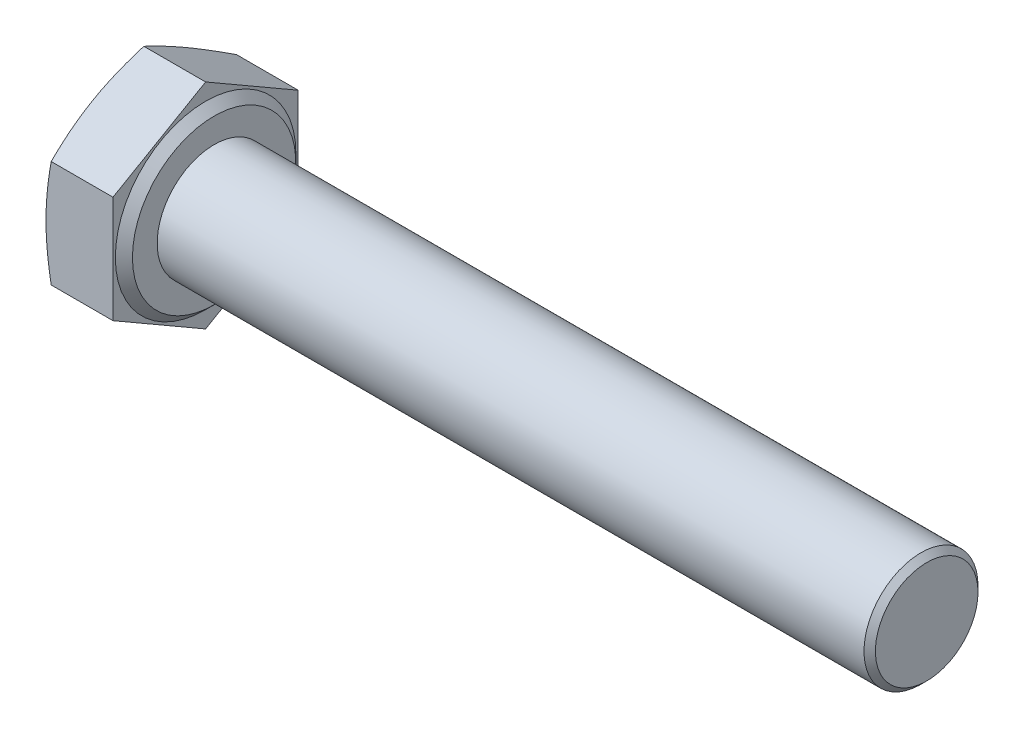
ISO-10303-21;
HEADER;
FILE_DESCRIPTION(('STEP AP214'),'2;1');
FILE_NAME('part.step','',(''),(''),'','','');
FILE_SCHEMA(('AUTOMOTIVE_DESIGN { 1 0 10303 214 1 1 1 1 }'));
ENDSEC;
DATA;
#1=APPLICATION_CONTEXT('core data for automotive mechanical design processes');
#2=APPLICATION_PROTOCOL_DEFINITION('international standard','automotive_design',2000,#1);
#3=PRODUCT_CONTEXT('',#1,'mechanical');
#4=PRODUCT('Part','Part','',(#3));
#5=PRODUCT_RELATED_PRODUCT_CATEGORY('part','',(#4));
#6=PRODUCT_DEFINITION_FORMATION('','',#4);
#7=PRODUCT_DEFINITION_CONTEXT('part definition',#1,'design');
#8=PRODUCT_DEFINITION('design','',#6,#7);
#9=PRODUCT_DEFINITION_SHAPE('','',#8);
#10=(LENGTH_UNIT() NAMED_UNIT(*) SI_UNIT(.MILLI.,.METRE.));
#11=(NAMED_UNIT(*) PLANE_ANGLE_UNIT() SI_UNIT($,.RADIAN.));
#12=(NAMED_UNIT(*) SI_UNIT($,.STERADIAN.) SOLID_ANGLE_UNIT());
#13=UNCERTAINTY_MEASURE_WITH_UNIT(LENGTH_MEASURE(1.E-05),#10,'distance_accuracy_value','');
#14=(GEOMETRIC_REPRESENTATION_CONTEXT(3) GLOBAL_UNCERTAINTY_ASSIGNED_CONTEXT((#13)) GLOBAL_UNIT_ASSIGNED_CONTEXT((#10,
#11,#12)) REPRESENTATION_CONTEXT('',''));
#15=CARTESIAN_POINT('',(0.,0.,0.));
#16=DIRECTION('',(0.,0.,1.));
#17=DIRECTION('',(1.,0.,0.));
#18=AXIS2_PLACEMENT_3D('',#15,#16,#17);
#19=CARTESIAN_POINT('',(5.3,-11.2583302491977,-6.5));
#20=DIRECTION('',(1.,0.,0.));
#21=DIRECTION('',(0.,0.,-1.));
#22=AXIS2_PLACEMENT_3D('',#19,#20,#21);
#23=PLANE('',#22);
#24=CARTESIAN_POINT('',(5.3,0.,0.));
#25=DIRECTION('',(-1.,0.,0.));
#26=DIRECTION('',(0.,0.,1.));
#27=AXIS2_PLACEMENT_3D('',#24,#25,#26);
#28=CIRCLE('',#27,5.735);
#29=CARTESIAN_POINT('',(5.3,0.,5.735));
#30=VERTEX_POINT('',#29);
#31=EDGE_CURVE('E253',#30,#30,#28,.T.);
#32=ORIENTED_EDGE('',*,*,#31,.F.);
#33=EDGE_LOOP('',(#32));
#34=FACE_BOUND('',#33,.T.);
#35=CARTESIAN_POINT('',(5.3,0.,0.));
#36=DIRECTION('',(1.,0.,0.));
#37=DIRECTION('',(0.,0.,-1.));
#38=AXIS2_PLACEMENT_3D('',#35,#36,#37);
#39=CIRCLE('',#38,4.);
#40=CARTESIAN_POINT('',(5.3,0.,-4.));
#41=VERTEX_POINT('',#40);
#42=EDGE_CURVE('E381',#41,#41,#39,.T.);
#43=ORIENTED_EDGE('',*,*,#42,.F.);
#44=EDGE_LOOP('',(#43));
#45=FACE_BOUND('',#44,.T.);
#46=ADVANCED_FACE('F36',(#34,#45),#23,.T.);
#47=CARTESIAN_POINT('',(5.3,-3.75277674973257,6.5));
#48=DIRECTION('',(0.,0.866025403784439,-0.5));
#49=DIRECTION('',(0.,0.5,0.866025403784439));
#50=AXIS2_PLACEMENT_3D('',#47,#48,#49);
#51=PLANE('',#50);
#52=CARTESIAN_POINT('',(0.366033571399917,-7.50566896951897,-0.000199999999999111));
#53=CARTESIAN_POINT('',(0.309444020524644,-7.35024872046989,0.268995767878022));
#54=CARTESIAN_POINT('',(0.257966025840877,-7.19431596160415,0.53907922879786));
#55=CARTESIAN_POINT('',(0.167398453510307,-6.88143655010517,1.08100226615635));
#56=CARTESIAN_POINT('',(0.128318569974497,-6.72448920151499,1.35284304802776));
#57=CARTESIAN_POINT('',(0.0651079760464742,-6.41132237124561,1.89526390929962));
#58=CARTESIAN_POINT('',(0.0408393932631412,-6.25511004161362,2.16583160099093));
#59=CARTESIAN_POINT('',(0.00828840244356363,-5.94232007682223,2.70759971210731));
#60=CARTESIAN_POINT('',(0.,-5.78574260071054,2.97879985605365));
#61=CARTESIAN_POINT('',(0.,-5.47258764848716,3.52120014394635));
#62=CARTESIAN_POINT('',(0.00828840244356352,-5.31601017237547,3.79240028789269));
#63=CARTESIAN_POINT('',(0.0408393932631413,-5.00322020758407,4.33416839900907));
#64=CARTESIAN_POINT('',(0.0651079760464745,-4.84700787795208,4.60473609070038));
#65=CARTESIAN_POINT('',(0.128318569974498,-4.53384104768271,5.14715695197224));
#66=CARTESIAN_POINT('',(0.167398453510307,-4.37689369909253,5.41899773384365));
#67=CARTESIAN_POINT('',(0.257966025840878,-4.06401428759354,5.96092077120214));
#68=CARTESIAN_POINT('',(0.309444020524644,-3.90808152872781,6.23100423212198));
#69=CARTESIAN_POINT('',(0.366033571399917,-3.75266127967873,6.5002));
#70=B_SPLINE_CURVE_WITH_KNOTS('',3,(#52,#53,#54,#55,#56,#57,#58,#59,#60,#61,#62,#63,#64,#65,#66,
#67,#68,#69),.UNSPECIFIED.,.F.,.F.,(4,2,2,2,2,2,2,2,4),(0.,0.947946776379686,1.89663293805397,
2.83634783106806,3.77571015417899,4.71507247728992,5.65478737030401,6.6034735319783,
7.55142030835798),.UNSPECIFIED.);
#71=CARTESIAN_POINT('',(0.365991542767518,-7.50555349946513,0.));
#72=VERTEX_POINT('',#71);
#73=CARTESIAN_POINT('',(0.,-5.62916512459885,3.25));
#74=VERTEX_POINT('',#73);
#75=EDGE_CURVE('E170',#72,#74,#70,.T.);
#76=ORIENTED_EDGE('',*,*,#75,.F.);
#77=DIRECTION('',(-1.,0.,0.));
#78=VECTOR('',#77,1.);
#79=CARTESIAN_POINT('',(5.3,-7.50555349946513,0.));
#80=LINE('',#79,#78);
#81=CARTESIAN_POINT('',(4.7,-7.50555349946513,0.));
#82=VERTEX_POINT('',#81);
#83=EDGE_CURVE('E145',#82,#72,#80,.T.);
#84=ORIENTED_EDGE('',*,*,#83,.F.);
#85=DIRECTION('',(0.,-0.5,-0.866025403784439));
#86=VECTOR('',#85,1.);
#87=CARTESIAN_POINT('',(4.7,-3.75277674973257,6.5));
#88=LINE('',#87,#86);
#89=CARTESIAN_POINT('',(4.7,-3.75277674973257,6.5));
#90=VERTEX_POINT('',#89);
#91=EDGE_CURVE('E136',#90,#82,#88,.T.);
#92=ORIENTED_EDGE('',*,*,#91,.F.);
#93=DIRECTION('',(-1.,0.,0.));
#94=VECTOR('',#93,1.);
#95=CARTESIAN_POINT('',(5.3,-3.75277674973257,6.5));
#96=LINE('',#95,#94);
#97=CARTESIAN_POINT('',(0.365991542767518,-3.75277674973257,6.5));
#98=VERTEX_POINT('',#97);
#99=EDGE_CURVE('E131',#90,#98,#96,.T.);
#100=ORIENTED_EDGE('',*,*,#99,.T.);
#101=EDGE_CURVE('E124',#74,#98,#70,.T.);
#102=ORIENTED_EDGE('',*,*,#101,.F.);
#103=EDGE_LOOP('',(#76,#84,#92,#100,#102));
#104=FACE_BOUND('',#103,.T.);
#105=ADVANCED_FACE('F233',(#104),#51,.F.);
#106=CARTESIAN_POINT('',(5.3,-7.50555349946513,0.));
#107=DIRECTION('',(0.,0.866025403784439,0.5));
#108=DIRECTION('',(0.,-0.5,0.866025403784439));
#109=AXIS2_PLACEMENT_3D('',#106,#107,#108);
#110=PLANE('',#109);
#111=CARTESIAN_POINT('',(0.366033571399918,-3.75266127967873,-6.5002));
#112=CARTESIAN_POINT('',(0.309444020524644,-3.90808152872781,-6.23100423212198));
#113=CARTESIAN_POINT('',(0.257966025840878,-4.06401428759355,-5.96092077120214));
#114=CARTESIAN_POINT('',(0.167398453510308,-4.37689369909253,-5.41899773384365));
#115=CARTESIAN_POINT('',(0.128318569974498,-4.53384104768271,-5.14715695197224));
#116=CARTESIAN_POINT('',(0.0651079760464751,-4.84700787795209,-4.60473609070038));
#117=CARTESIAN_POINT('',(0.0408393932631418,-5.00322020758408,-4.33416839900907));
#118=CARTESIAN_POINT('',(0.00828840244356392,-5.31601017237547,-3.79240028789269));
#119=CARTESIAN_POINT('',(0.,-5.47258764848716,-3.52120014394635));
#120=CARTESIAN_POINT('',(0.,-5.78574260071054,-2.97879985605365));
#121=CARTESIAN_POINT('',(0.00828840244356391,-5.94232007682223,-2.7075997121073));
#122=CARTESIAN_POINT('',(0.0408393932631417,-6.25511004161362,-2.16583160099092));
#123=CARTESIAN_POINT('',(0.0651079760464749,-6.41132237124561,-1.89526390929962));
#124=CARTESIAN_POINT('',(0.128318569974498,-6.72448920151499,-1.35284304802776));
#125=CARTESIAN_POINT('',(0.167398453510307,-6.88143655010517,-1.08100226615635));
#126=CARTESIAN_POINT('',(0.257966025840877,-7.19431596160415,-0.539079228797858));
#127=CARTESIAN_POINT('',(0.309444020524644,-7.35024872046989,-0.26899576787802));
#128=CARTESIAN_POINT('',(0.366033571399917,-7.50566896951897,0.000200000000000513));
#129=B_SPLINE_CURVE_WITH_KNOTS('',3,(#111,#112,#113,#114,#115,#116,#117,#118,#119,#120,#121,
#122,#123,#124,#125,#126,#127,#128),.UNSPECIFIED.,.F.,.F.,(4,2,2,2,2,2,2,2,4),(0.,
0.947946776379686,1.89663293805397,2.83634783106806,3.77571015417899,4.71507247728992,
5.65478737030401,6.6034735319783,7.55142030835798),.UNSPECIFIED.);
#130=CARTESIAN_POINT('',(0.365991542767518,-3.75277674973257,-6.5));
#131=VERTEX_POINT('',#130);
#132=CARTESIAN_POINT('',(0.,-5.62916512459885,-3.25));
#133=VERTEX_POINT('',#132);
#134=EDGE_CURVE('E176',#131,#133,#129,.T.);
#135=ORIENTED_EDGE('',*,*,#134,.F.);
#136=DIRECTION('',(-1.,0.,0.));
#137=VECTOR('',#136,1.);
#138=CARTESIAN_POINT('',(5.3,-3.75277674973257,-6.5));
#139=LINE('',#138,#137);
#140=CARTESIAN_POINT('',(4.7,-3.75277674973257,-6.5));
#141=VERTEX_POINT('',#140);
#142=EDGE_CURVE('E142',#141,#131,#139,.T.);
#143=ORIENTED_EDGE('',*,*,#142,.F.);
#144=DIRECTION('',(0.,0.5,-0.866025403784439));
#145=VECTOR('',#144,1.);
#146=CARTESIAN_POINT('',(4.7,-7.50555349946513,0.));
#147=LINE('',#146,#145);
#148=EDGE_CURVE('E262',#82,#141,#147,.T.);
#149=ORIENTED_EDGE('',*,*,#148,.F.);
#150=ORIENTED_EDGE('',*,*,#83,.T.);
#151=EDGE_CURVE('E168',#133,#72,#129,.T.);
#152=ORIENTED_EDGE('',*,*,#151,.F.);
#153=EDGE_LOOP('',(#135,#143,#149,#150,#152));
#154=FACE_BOUND('',#153,.T.);
#155=ADVANCED_FACE('F185',(#154),#110,.F.);
#156=CARTESIAN_POINT('',(5.3,-3.75277674973257,-6.5));
#157=DIRECTION('',(0.,0.,1.));
#158=DIRECTION('',(0.,-1.,0.));
#159=AXIS2_PLACEMENT_3D('',#156,#157,#158);
#160=PLANE('',#159);
#161=CARTESIAN_POINT('',(1.95571401153663,-9.93603441979221,-6.5));
#162=CARTESIAN_POINT('',(1.86616567875673,-9.64195086953644,-6.5));
#163=CARTESIAN_POINT('',(1.77766225828461,-9.34754322845582,-6.5));
#164=CARTESIAN_POINT('',(1.60332328599293,-8.75791476814704,-6.5));
#165=CARTESIAN_POINT('',(1.51748794528308,-8.4626938865736,-6.5));
#166=CARTESIAN_POINT('',(1.3489203902146,-7.87076864639478,-6.5));
#167=CARTESIAN_POINT('',(1.26619426431368,-7.57406254766227,-6.5));
#168=CARTESIAN_POINT('',(1.10481363643384,-6.9795466370098,-6.5));
#169=CARTESIAN_POINT('',(1.02615906134927,-6.68173684500988,-6.5));
#170=CARTESIAN_POINT('',(0.874868353864858,-6.0884951603723,-6.5));
#171=CARTESIAN_POINT('',(0.802169973926058,-5.79307922138507,-6.5));
#172=CARTESIAN_POINT('',(0.662962609513869,-5.20077731548877,-6.5));
#173=CARTESIAN_POINT('',(0.596453729200673,-4.90389132392938,-6.5));
#174=CARTESIAN_POINT('',(0.471175956763028,-4.3085828816641,-6.5));
#175=CARTESIAN_POINT('',(0.412404424419993,-4.01016099136059,-6.5));
#176=CARTESIAN_POINT('',(0.304390922908062,-3.41158466459654,-6.5));
#177=CARTESIAN_POINT('',(0.255148634453813,-3.1114302865316,-6.5));
#178=CARTESIAN_POINT('',(0.173069796227443,-2.54318759814721,-6.5));
#179=CARTESIAN_POINT('',(0.139012858796123,-2.2752772220122,-6.5));
#180=CARTESIAN_POINT('',(0.081362576226893,-1.73832361178718,-6.5));
#181=CARTESIAN_POINT('',(0.0577689261779796,-1.46928041093954,-6.5));
#182=CARTESIAN_POINT('',(0.0221814401839781,-0.930606870053421,-6.5));
#183=CARTESIAN_POINT('',(0.0101793995170961,-0.660977080895949,-6.5));
#184=CARTESIAN_POINT('',(-0.00161720684022572,-0.12144774373269,-6.5));
#185=CARTESIAN_POINT('',(-0.00141185873888266,0.148451802354621,-6.5));
#186=CARTESIAN_POINT('',(0.0112271247261067,0.689329214219691,-6.5));
#187=CARTESIAN_POINT('',(0.0237227706095074,0.960305606843374,-6.5));
#188=CARTESIAN_POINT('',(0.0603672970671052,1.50146246694377,-6.5));
#189=CARTESIAN_POINT('',(0.0845164576092169,1.77164291514155,-6.5));
#190=CARTESIAN_POINT('',(0.143338326857308,2.31107447569056,-6.5));
#191=CARTESIAN_POINT('',(0.178020074424773,2.58032458812684,-6.5));
#192=CARTESIAN_POINT('',(0.256500333618585,3.1174778193519,-6.5));
#193=CARTESIAN_POINT('',(0.300298894108137,3.38538093091332,-6.5));
#194=CARTESIAN_POINT('',(0.398107689520772,3.93393795895059,-6.5));
#195=CARTESIAN_POINT('',(0.452535533885652,4.21451675121541,-6.5));
#196=CARTESIAN_POINT('',(0.568396435461318,4.77423349044454,-6.5));
#197=CARTESIAN_POINT('',(0.629830020802258,5.05337132712171,-6.5));
#198=CARTESIAN_POINT('',(0.75841232428275,5.61040510315648,-6.5));
#199=CARTESIAN_POINT('',(0.825562702223159,5.88830065701456,-6.5));
#200=CARTESIAN_POINT('',(0.96448662108934,6.44292100824928,-6.5));
#201=CARTESIAN_POINT('',(1.03626005120185,6.71964583351865,-6.5));
#202=CARTESIAN_POINT('',(1.18365878714095,7.27244327517417,-6.5));
#203=CARTESIAN_POINT('',(1.25928890210724,7.54851460470713,-6.5));
#204=CARTESIAN_POINT('',(1.41363061537329,8.0997961525575,-6.5));
#205=CARTESIAN_POINT('',(1.49234225905049,8.37500635812984,-6.5));
#206=CARTESIAN_POINT('',(1.73221562213793,9.19944034893931,-6.5));
#207=CARTESIAN_POINT('',(1.89714297079544,9.74756777924885,-6.5));
#208=CARTESIAN_POINT('',(2.23202264329116,10.8356483510067,-6.5));
#209=CARTESIAN_POINT('',(2.40189940860558,11.3756249384803,-6.5));
#210=CARTESIAN_POINT('',(2.74647915341987,12.4540613435461,-6.5));
#211=CARTESIAN_POINT('',(2.92118236447534,12.992521086995,-6.5));
#212=CARTESIAN_POINT('',(3.27344634384541,14.0662397055123,-6.5));
#213=CARTESIAN_POINT('',(3.45099375441752,14.6015029735514,-6.5));
#214=CARTESIAN_POINT('',(3.71928521382427,15.4037135281966,-6.5));
#215=CARTESIAN_POINT('',(3.80904043563063,15.6709922356054,-6.5));
#216=CARTESIAN_POINT('',(3.98913165710618,16.2053532221131,-6.5));
#217=CARTESIAN_POINT('',(4.07946765535968,16.472435501689,-6.5));
#218=CARTESIAN_POINT('',(4.17005511154135,16.739432454229,-6.5));
#219=B_SPLINE_CURVE_WITH_KNOTS('',3,(#161,#162,#163,#164,#165,#166,#167,#168,#169,#170,#171,
#172,#173,#174,#175,#176,#177,#178,#179,#180,#181,#182,#183,#184,#185,#186,#187,#188,#189,#190,
#191,#192,#193,#194,#195,#196,#197,#198,#199,#200,#201,#202,#203,#204,#205,#206,#207,#208,#209,
#210,#211,#212,#213,#214,#215,#216,#217,#218),.UNSPECIFIED.,.F.,.F.,(4,2,2,2,2,2,2,2,2,2,2,2,2,
2,2,2,2,2,2,2,2,2,2,2,2,2,2,2,4),(0.,0.922251807914867,1.84457640347734,2.76862182748244,
3.69265065427671,4.60528667929008,5.51793805985192,6.43027720430947,7.34258577477969,
8.15260701482545,8.96260464846418,9.77202853205704,10.5814466995231,11.3949698340379,
12.2085125138762,13.0227553426382,13.8370025355942,14.6943202218969,15.5517025801604,
16.409334723443,17.2669463171694,18.1256547962619,18.9843759251336,20.7015065555132,
22.3996837910258,24.0979426409823,25.7897577219944,26.6355971199987,27.4814344570169),.UNSPECIFIED.);
#220=CARTESIAN_POINT('',(0.365991542767518,3.75277674973257,-6.5));
#221=VERTEX_POINT('',#220);
#222=CARTESIAN_POINT('',(0.,0.,-6.5));
#223=VERTEX_POINT('',#222);
#224=EDGE_CURVE('E267',#221,#223,#219,.F.);
#225=ORIENTED_EDGE('',*,*,#224,.F.);
#226=DIRECTION('',(-1.,0.,0.));
#227=VECTOR('',#226,1.);
#228=CARTESIAN_POINT('',(5.3,3.75277674973257,-6.5));
#229=LINE('',#228,#227);
#230=CARTESIAN_POINT('',(4.7,3.75277674973257,-6.5));
#231=VERTEX_POINT('',#230);
#232=EDGE_CURVE('E133',#231,#221,#229,.T.);
#233=ORIENTED_EDGE('',*,*,#232,.F.);
#234=DIRECTION('',(0.,1.,0.));
#235=VECTOR('',#234,1.);
#236=CARTESIAN_POINT('',(4.7,-3.75277674973257,-6.5));
#237=LINE('',#236,#235);
#238=EDGE_CURVE('E255',#141,#231,#237,.T.);
#239=ORIENTED_EDGE('',*,*,#238,.F.);
#240=ORIENTED_EDGE('',*,*,#142,.T.);
#241=EDGE_CURVE('E179',#223,#131,#219,.F.);
#242=ORIENTED_EDGE('',*,*,#241,.F.);
#243=EDGE_LOOP('',(#225,#233,#239,#240,#242));
#244=FACE_BOUND('',#243,.T.);
#245=ADVANCED_FACE('F241',(#244),#160,.F.);
#246=CARTESIAN_POINT('',(5.3,3.75277674973257,-6.5));
#247=DIRECTION('',(0.,-0.866025403784439,0.5));
#248=DIRECTION('',(0.,-0.5,-0.866025403784439));
#249=AXIS2_PLACEMENT_3D('',#246,#247,#248);
#250=PLANE('',#249);
#251=CARTESIAN_POINT('',(0.366033571399918,7.50566896951897,0.000199999999999762));
#252=CARTESIAN_POINT('',(0.309444020524645,7.35024872046989,-0.268995767878022));
#253=CARTESIAN_POINT('',(0.257966025840879,7.19431596160416,-0.539079228797859));
#254=CARTESIAN_POINT('',(0.167398453510308,6.88143655010517,-1.08100226615635));
#255=CARTESIAN_POINT('',(0.128318569974499,6.72448920151499,-1.35284304802776));
#256=CARTESIAN_POINT('',(0.0651079760464753,6.41132237124562,-1.89526390929962));
#257=CARTESIAN_POINT('',(0.0408393932631422,6.25511004161363,-2.16583160099092));
#258=CARTESIAN_POINT('',(0.00828840244356455,5.94232007682223,-2.7075997121073));
#259=CARTESIAN_POINT('',(0.,5.78574260071054,-2.97879985605365));
#260=CARTESIAN_POINT('',(0.,5.47258764848716,-3.52120014394635));
#261=CARTESIAN_POINT('',(0.0082884024435642,5.31601017237547,-3.79240028789269));
#262=CARTESIAN_POINT('',(0.0408393932631419,5.00322020758408,-4.33416839900907));
#263=CARTESIAN_POINT('',(0.0651079760464753,4.84700787795209,-4.60473609070038));
#264=CARTESIAN_POINT('',(0.128318569974498,4.53384104768271,-5.14715695197224));
#265=CARTESIAN_POINT('',(0.167398453510308,4.37689369909253,-5.41899773384365));
#266=CARTESIAN_POINT('',(0.257966025840878,4.06401428759355,-5.96092077120214));
#267=CARTESIAN_POINT('',(0.309444020524644,3.90808152872781,-6.23100423212198));
#268=CARTESIAN_POINT('',(0.366033571399918,3.75266127967873,-6.5002));
#269=B_SPLINE_CURVE_WITH_KNOTS('',3,(#251,#252,#253,#254,#255,#256,#257,#258,#259,#260,#261,
#262,#263,#264,#265,#266,#267,#268),.UNSPECIFIED.,.F.,.F.,(4,2,2,2,2,2,2,2,4),(0.,
0.947946776379686,1.89663293805397,2.83634783106806,3.77571015417899,4.71507247728992,
5.65478737030401,6.6034735319783,7.55142030835798),.UNSPECIFIED.);
#270=CARTESIAN_POINT('',(0.365991542767518,7.50555349946514,0.));
#271=VERTEX_POINT('',#270);
#272=CARTESIAN_POINT('',(0.,5.62916512459885,-3.25));
#273=VERTEX_POINT('',#272);
#274=EDGE_CURVE('E51',#271,#273,#269,.T.);
#275=ORIENTED_EDGE('',*,*,#274,.F.);
#276=DIRECTION('',(-1.,0.,0.));
#277=VECTOR('',#276,1.);
#278=CARTESIAN_POINT('',(5.3,7.50555349946514,0.));
#279=LINE('',#278,#277);
#280=CARTESIAN_POINT('',(4.7,7.50555349946514,0.));
#281=VERTEX_POINT('',#280);
#282=EDGE_CURVE('E130',#281,#271,#279,.T.);
#283=ORIENTED_EDGE('',*,*,#282,.F.);
#284=DIRECTION('',(0.,0.5,0.866025403784439));
#285=VECTOR('',#284,1.);
#286=CARTESIAN_POINT('',(4.7,3.75277674973257,-6.5));
#287=LINE('',#286,#285);
#288=EDGE_CURVE('E252',#231,#281,#287,.T.);
#289=ORIENTED_EDGE('',*,*,#288,.F.);
#290=ORIENTED_EDGE('',*,*,#232,.T.);
#291=EDGE_CURVE('E182',#273,#221,#269,.T.);
#292=ORIENTED_EDGE('',*,*,#291,.F.);
#293=EDGE_LOOP('',(#275,#283,#289,#290,#292));
#294=FACE_BOUND('',#293,.T.);
#295=ADVANCED_FACE('F248',(#294),#250,.F.);
#296=CARTESIAN_POINT('',(5.3,7.50555349946514,0.));
#297=DIRECTION('',(0.,-0.866025403784439,-0.5));
#298=DIRECTION('',(0.,0.5,-0.866025403784439));
#299=AXIS2_PLACEMENT_3D('',#296,#297,#298);
#300=PLANE('',#299);
#301=CARTESIAN_POINT('',(0.366033571399918,3.75266127967873,6.5002));
#302=CARTESIAN_POINT('',(0.309444020524645,3.90808152872782,6.23100423212198));
#303=CARTESIAN_POINT('',(0.257966025840878,4.06401428759355,5.96092077120214));
#304=CARTESIAN_POINT('',(0.167398453510308,4.37689369909254,5.41899773384365));
#305=CARTESIAN_POINT('',(0.128318569974499,4.53384104768271,5.14715695197224));
#306=CARTESIAN_POINT('',(0.0651079760464755,4.84700787795209,4.60473609070038));
#307=CARTESIAN_POINT('',(0.0408393932631422,5.00322020758408,4.33416839900907));
#308=CARTESIAN_POINT('',(0.00828840244356452,5.31601017237548,3.79240028789269));
#309=CARTESIAN_POINT('',(0.,5.47258764848716,3.52120014394635));
#310=CARTESIAN_POINT('',(0.,5.78574260071054,2.97879985605365));
#311=CARTESIAN_POINT('',(0.00828840244356448,5.94232007682223,2.7075997121073));
#312=CARTESIAN_POINT('',(0.0408393932631421,6.25511004161363,2.16583160099092));
#313=CARTESIAN_POINT('',(0.0651079760464755,6.41132237124562,1.89526390929962));
#314=CARTESIAN_POINT('',(0.128318569974499,6.724489201515,1.35284304802776));
#315=CARTESIAN_POINT('',(0.167398453510308,6.88143655010517,1.08100226615635));
#316=CARTESIAN_POINT('',(0.257966025840879,7.19431596160416,0.539079228797856));
#317=CARTESIAN_POINT('',(0.309444020524645,7.35024872046989,0.268995767878019));
#318=CARTESIAN_POINT('',(0.366033571399918,7.50566896951897,-0.000200000000001495));
#319=B_SPLINE_CURVE_WITH_KNOTS('',3,(#301,#302,#303,#304,#305,#306,#307,#308,#309,#310,#311,
#312,#313,#314,#315,#316,#317,#318),.UNSPECIFIED.,.F.,.F.,(4,2,2,2,2,2,2,2,4),(0.,
0.947946776379686,1.89663293805397,2.83634783106806,3.77571015417899,4.71507247728992,
5.65478737030402,6.6034735319783,7.55142030835798),.UNSPECIFIED.);
#320=CARTESIAN_POINT('',(0.365991542767518,3.75277674973257,6.5));
#321=VERTEX_POINT('',#320);
#322=CARTESIAN_POINT('',(0.,5.62916512459885,3.25));
#323=VERTEX_POINT('',#322);
#324=EDGE_CURVE('E59',#321,#323,#319,.T.);
#325=ORIENTED_EDGE('',*,*,#324,.F.);
#326=DIRECTION('',(-1.,0.,0.));
#327=VECTOR('',#326,1.);
#328=CARTESIAN_POINT('',(5.3,3.75277674973257,6.5));
#329=LINE('',#328,#327);
#330=CARTESIAN_POINT('',(4.7,3.75277674973257,6.5));
#331=VERTEX_POINT('',#330);
#332=EDGE_CURVE('E121',#331,#321,#329,.T.);
#333=ORIENTED_EDGE('',*,*,#332,.F.);
#334=DIRECTION('',(0.,-0.5,0.866025403784439));
#335=VECTOR('',#334,1.);
#336=CARTESIAN_POINT('',(4.7,7.50555349946514,0.));
#337=LINE('',#336,#335);
#338=EDGE_CURVE('E250',#281,#331,#337,.T.);
#339=ORIENTED_EDGE('',*,*,#338,.F.);
#340=ORIENTED_EDGE('',*,*,#282,.T.);
#341=EDGE_CURVE('E123',#323,#271,#319,.T.);
#342=ORIENTED_EDGE('',*,*,#341,.F.);
#343=EDGE_LOOP('',(#325,#333,#339,#340,#342));
#344=FACE_BOUND('',#343,.T.);
#345=ADVANCED_FACE('F119',(#344),#300,.F.);
#346=CARTESIAN_POINT('',(5.3,3.75277674973257,6.5));
#347=DIRECTION('',(0.,0.,-1.));
#348=DIRECTION('',(-1.,0.,0.));
#349=AXIS2_PLACEMENT_3D('',#346,#347,#348);
#350=PLANE('',#349);
#351=CARTESIAN_POINT('',(1.95571366019449,-9.93603326628052,6.5));
#352=CARTESIAN_POINT('',(1.86616534413014,-9.64194976069929,6.5));
#353=CARTESIAN_POINT('',(1.77766194032887,-9.34754216431854,6.5));
#354=CARTESIAN_POINT('',(1.60332300117888,-8.75791379350499,6.5));
#355=CARTESIAN_POINT('',(1.51748767693981,-8.46269295672693,6.5));
#356=CARTESIAN_POINT('',(1.34892015458645,-7.87076780655456,6.5));
#357=CARTESIAN_POINT('',(1.26619404492703,-7.57406175303402,6.5));
#358=CARTESIAN_POINT('',(1.1048134490191,-6.97954593299351,6.5));
#359=CARTESIAN_POINT('',(1.02615888966496,-6.68173618639357,6.5));
#360=CARTESIAN_POINT('',(0.874868212658234,-6.08849459225876,6.5));
#361=CARTESIAN_POINT('',(0.802169847476455,-5.79307869837104,6.5));
#362=CARTESIAN_POINT('',(0.662962511402571,-5.20077688303508,6.5));
#363=CARTESIAN_POINT('',(0.596453644670518,-4.90389093693656,6.5));
#364=CARTESIAN_POINT('',(0.471175897619687,-4.30858258594115,6.5));
#365=CARTESIAN_POINT('',(0.412404377085273,-4.01016074144599,6.5));
#366=CARTESIAN_POINT('',(0.304390896673231,-3.41158450682122,6.5));
#367=CARTESIAN_POINT('',(0.255148617510889,-3.11143017508711,6.5));
#368=CARTESIAN_POINT('',(0.173069786014059,-2.54318752224493,6.5));
#369=CARTESIAN_POINT('',(0.139012848166771,-2.27527713500587,6.5));
#370=CARTESIAN_POINT('',(0.0813625657814456,-1.738323502513,6.5));
#371=CARTESIAN_POINT('',(0.057768916332377,-1.46928029050156,6.5));
#372=CARTESIAN_POINT('',(0.0221814326400004,-0.930606727311483,6.5));
#373=CARTESIAN_POINT('',(0.0101793936737363,-0.66097692701388,6.5));
#374=CARTESIAN_POINT('',(-0.00161720821182384,-0.121447567660371,6.5));
#375=CARTESIAN_POINT('',(-0.00141185733934027,0.148451989477059,6.5));
#376=CARTESIAN_POINT('',(0.0112271326109267,0.689329423740301,6.5));
#377=CARTESIAN_POINT('',(0.0237227822313583,0.960305827710796,6.5));
#378=CARTESIAN_POINT('',(0.0603673168833658,1.50146271031067,6.5));
#379=CARTESIAN_POINT('',(0.0845164818829595,1.77164316966111,6.5));
#380=CARTESIAN_POINT('',(0.143338360513653,2.31107475237115,6.5));
#381=CARTESIAN_POINT('',(0.178020113008005,2.58032487581547,6.5));
#382=CARTESIAN_POINT('',(0.256500382296737,3.11747812890285,6.5));
#383=CARTESIAN_POINT('',(0.300298947954333,3.38538125131852,6.5));
#384=CARTESIAN_POINT('',(0.3981077520473,3.93393829023267,6.5));
#385=CARTESIAN_POINT('',(0.452535599586703,4.21451708257566,6.5));
#386=CARTESIAN_POINT('',(0.568396506983388,4.77423382199686,6.5));
#387=CARTESIAN_POINT('',(0.6298300949707,5.05337165878795,6.5));
#388=CARTESIAN_POINT('',(0.758412403296521,5.61040543509077,6.5));
#389=CARTESIAN_POINT('',(0.825562783435459,5.88830098910306,6.5));
#390=CARTESIAN_POINT('',(0.964486706334887,6.4429213407063,6.5));
#391=CARTESIAN_POINT('',(1.03626013828214,6.71964616618997,6.5));
#392=CARTESIAN_POINT('',(1.18365887757004,7.27244360821656,6.5));
#393=CARTESIAN_POINT('',(1.25928899404845,7.54851493790678,6.5));
#394=CARTESIAN_POINT('',(1.41363071010197,8.0997964861227,6.5));
#395=CARTESIAN_POINT('',(1.4923423550545,8.37500669190332,6.5));
#396=CARTESIAN_POINT('',(1.73221572169175,9.1994406834194,6.5));
#397=CARTESIAN_POINT('',(1.8971430723439,9.74756811429359,6.5));
#398=CARTESIAN_POINT('',(2.2320227472408,10.8356486837444,6.5));
#399=CARTESIAN_POINT('',(2.40189951292265,11.3756252683587,6.5));
#400=CARTESIAN_POINT('',(2.74647925811128,12.4540616678074,6.5));
#401=CARTESIAN_POINT('',(2.92118246917361,12.9925214084985,6.5));
#402=CARTESIAN_POINT('',(3.27344644846169,14.0662400220233,6.5));
#403=CARTESIAN_POINT('',(3.45099385894873,14.6015032878262,6.5));
#404=CARTESIAN_POINT('',(3.71928531810861,15.4037138391588,6.5));
#405=CARTESIAN_POINT('',(3.80904053981336,15.6709925454721,6.5));
#406=CARTESIAN_POINT('',(3.98913176105164,16.2053535297995,6.5));
#407=CARTESIAN_POINT('',(4.0794677591695,16.4724358082908,6.5));
#408=CARTESIAN_POINT('',(4.17005521520151,16.7394327597508,6.5));
#409=B_SPLINE_CURVE_WITH_KNOTS('',3,(#351,#352,#353,#354,#355,#356,#357,#358,#359,#360,#361,
#362,#363,#364,#365,#366,#367,#368,#369,#370,#371,#372,#373,#374,#375,#376,#377,#378,#379,#380,
#381,#382,#383,#384,#385,#386,#387,#388,#389,#390,#391,#392,#393,#394,#395,#396,#397,#398,#399,
#400,#401,#402,#403,#404,#405,#406,#407,#408),.UNSPECIFIED.,.F.,.F.,(4,2,2,2,2,2,2,2,2,2,2,2,2,
2,2,2,2,2,2,2,2,2,2,2,2,2,2,2,4),(0.,0.922251665094893,1.8445761178197,2.76862139808781,
3.69265008115161,4.60528596421703,5.5179372028105,6.43027620562617,7.34258463451264,
8.15260590773143,8.96260357454243,9.77202749125737,10.5814456918456,11.3949688608542,
12.2085115751932,13.0227544385919,13.8370016661854,14.694319354549,15.5517017148634,
16.4093338601525,17.2669454558881,18.1256539366375,18.9843750671642,20.7015057009012,
22.3996829285659,24.0979417706618,25.7897568452273,26.6355962400188,27.4814335738245),.UNSPECIFIED.);
#410=CARTESIAN_POINT('',(0.,0.,6.5));
#411=VERTEX_POINT('',#410);
#412=EDGE_CURVE('E114',#98,#411,#409,.T.);
#413=ORIENTED_EDGE('',*,*,#412,.F.);
#414=ORIENTED_EDGE('',*,*,#99,.F.);
#415=DIRECTION('',(0.,-1.,0.));
#416=VECTOR('',#415,1.);
#417=CARTESIAN_POINT('',(4.7,3.75277674973257,6.5));
#418=LINE('',#417,#416);
#419=EDGE_CURVE('E129',#331,#90,#418,.T.);
#420=ORIENTED_EDGE('',*,*,#419,.F.);
#421=ORIENTED_EDGE('',*,*,#332,.T.);
#422=EDGE_CURVE('E106',#411,#321,#409,.T.);
#423=ORIENTED_EDGE('',*,*,#422,.F.);
#424=EDGE_LOOP('',(#413,#414,#420,#421,#423));
#425=FACE_BOUND('',#424,.T.);
#426=ADVANCED_FACE('F127',(#425),#350,.F.);
#427=CARTESIAN_POINT('',(4.7,6.33500000000001,0.));
#428=DIRECTION('',(1.,0.,0.));
#429=DIRECTION('',(0.,0.,-1.));
#430=AXIS2_PLACEMENT_3D('',#427,#428,#429);
#431=PLANE('',#430);
#432=CARTESIAN_POINT('',(4.7,0.,0.));
#433=DIRECTION('',(-1.,0.,0.));
#434=DIRECTION('',(0.,0.,1.));
#435=AXIS2_PLACEMENT_3D('',#432,#433,#434);
#436=CIRCLE('',#435,6.33500000000001);
#437=CARTESIAN_POINT('',(4.7,0.,6.33500000000001));
#438=VERTEX_POINT('',#437);
#439=EDGE_CURVE('E258',#438,#438,#436,.T.);
#440=ORIENTED_EDGE('',*,*,#439,.T.);
#441=EDGE_LOOP('',(#440));
#442=FACE_BOUND('',#441,.T.);
#443=ORIENTED_EDGE('',*,*,#91,.T.);
#444=ORIENTED_EDGE('',*,*,#148,.T.);
#445=ORIENTED_EDGE('',*,*,#238,.T.);
#446=ORIENTED_EDGE('',*,*,#288,.T.);
#447=ORIENTED_EDGE('',*,*,#338,.T.);
#448=ORIENTED_EDGE('',*,*,#419,.T.);
#449=EDGE_LOOP('',(#443,#444,#445,#446,#447,#448));
#450=FACE_BOUND('',#449,.T.);
#451=ADVANCED_FACE('F214',(#442,#450),#431,.T.);
#452=CARTESIAN_POINT('',(4.7,0.,0.));
#453=DIRECTION('',(-1.,0.,0.));
#454=DIRECTION('',(0.,0.,1.));
#455=AXIS2_PLACEMENT_3D('',#452,#453,#454);
#456=CONICAL_SURFACE('',#455,6.33500000000001,0.785398163397453);
#457=ORIENTED_EDGE('',*,*,#31,.T.);
#458=EDGE_LOOP('',(#457));
#459=FACE_BOUND('',#458,.T.);
#460=ORIENTED_EDGE('',*,*,#439,.F.);
#461=EDGE_LOOP('',(#460));
#462=FACE_BOUND('',#461,.T.);
#463=ADVANCED_FACE('F272',(#459,#462),#456,.T.);
#464=CARTESIAN_POINT('',(0.,0.,0.));
#465=DIRECTION('',(1.,0.,0.));
#466=DIRECTION('',(0.,0.,-1.));
#467=AXIS2_PLACEMENT_3D('',#464,#465,#466);
#468=CONICAL_SURFACE('',#467,6.5,1.22173047639604);
#469=ORIENTED_EDGE('',*,*,#241,.T.);
#470=ORIENTED_EDGE('',*,*,#134,.T.);
#471=CARTESIAN_POINT('',(0.,0.,0.));
#472=DIRECTION('',(1.,0.,0.));
#473=DIRECTION('',(0.,0.,-1.));
#474=AXIS2_PLACEMENT_3D('',#471,#472,#473);
#475=CIRCLE('',#474,6.5);
#476=EDGE_CURVE('E149',#133,#223,#475,.T.);
#477=ORIENTED_EDGE('',*,*,#476,.T.);
#478=EDGE_LOOP('',(#469,#470,#477));
#479=FACE_BOUND('',#478,.T.);
#480=ADVANCED_FACE('F177',(#479),#468,.T.);
#481=ORIENTED_EDGE('',*,*,#151,.T.);
#482=ORIENTED_EDGE('',*,*,#75,.T.);
#483=EDGE_CURVE('E151',#74,#133,#475,.T.);
#484=ORIENTED_EDGE('',*,*,#483,.T.);
#485=EDGE_LOOP('',(#481,#482,#484));
#486=FACE_BOUND('',#485,.T.);
#487=ADVANCED_FACE('F166',(#486),#468,.T.);
#488=ORIENTED_EDGE('',*,*,#101,.T.);
#489=ORIENTED_EDGE('',*,*,#412,.T.);
#490=EDGE_CURVE('E160',#411,#74,#475,.T.);
#491=ORIENTED_EDGE('',*,*,#490,.T.);
#492=EDGE_LOOP('',(#488,#489,#491));
#493=FACE_BOUND('',#492,.T.);
#494=ADVANCED_FACE('F392',(#493),#468,.T.);
#495=ORIENTED_EDGE('',*,*,#324,.T.);
#496=CARTESIAN_POINT('',(0.,0.,0.));
#497=DIRECTION('',(-1.,0.,0.));
#498=DIRECTION('',(0.,0.,1.));
#499=AXIS2_PLACEMENT_3D('',#496,#497,#498);
#500=CIRCLE('',#499,6.5);
#501=EDGE_CURVE('E109',#411,#323,#500,.T.);
#502=ORIENTED_EDGE('',*,*,#501,.F.);
#503=ORIENTED_EDGE('',*,*,#422,.T.);
#504=EDGE_LOOP('',(#495,#502,#503));
#505=FACE_BOUND('',#504,.T.);
#506=ADVANCED_FACE('F107',(#505),#468,.T.);
#507=ORIENTED_EDGE('',*,*,#274,.T.);
#508=EDGE_CURVE('E156',#273,#323,#475,.T.);
#509=ORIENTED_EDGE('',*,*,#508,.T.);
#510=ORIENTED_EDGE('',*,*,#341,.T.);
#511=EDGE_LOOP('',(#507,#509,#510));
#512=FACE_BOUND('',#511,.T.);
#513=ADVANCED_FACE('F211',(#512),#468,.T.);
#514=ORIENTED_EDGE('',*,*,#224,.T.);
#515=EDGE_CURVE('E152',#223,#273,#475,.T.);
#516=ORIENTED_EDGE('',*,*,#515,.T.);
#517=ORIENTED_EDGE('',*,*,#291,.T.);
#518=EDGE_LOOP('',(#514,#516,#517));
#519=FACE_BOUND('',#518,.T.);
#520=ADVANCED_FACE('F206',(#519),#468,.T.);
#521=CARTESIAN_POINT('',(0.,-11.2583302491977,-6.5));
#522=DIRECTION('',(1.,0.,0.));
#523=DIRECTION('',(0.,0.,-1.));
#524=AXIS2_PLACEMENT_3D('',#521,#522,#523);
#525=PLANE('',#524);
#526=ORIENTED_EDGE('',*,*,#515,.F.);
#527=ORIENTED_EDGE('',*,*,#476,.F.);
#528=ORIENTED_EDGE('',*,*,#483,.F.);
#529=ORIENTED_EDGE('',*,*,#490,.F.);
#530=ORIENTED_EDGE('',*,*,#501,.T.);
#531=ORIENTED_EDGE('',*,*,#508,.F.);
#532=EDGE_LOOP('',(#526,#527,#528,#529,#530,#531));
#533=FACE_BOUND('',#532,.T.);
#534=ADVANCED_FACE('F184',(#533),#525,.F.);
#535=CARTESIAN_POINT('',(55.3,0.,0.));
#536=DIRECTION('',(-1.,0.,0.));
#537=DIRECTION('',(0.,0.,1.));
#538=AXIS2_PLACEMENT_3D('',#535,#536,#537);
#539=CYLINDRICAL_SURFACE('',#538,4.);
#540=CARTESIAN_POINT('',(54.9,0.,0.));
#541=DIRECTION('',(1.,0.,0.));
#542=DIRECTION('',(0.,0.,-1.));
#543=AXIS2_PLACEMENT_3D('',#540,#541,#542);
#544=CIRCLE('',#543,4.);
#545=CARTESIAN_POINT('',(54.9,0.,-4.));
#546=VERTEX_POINT('',#545);
#547=EDGE_CURVE('E11',#546,#546,#544,.F.);
#548=ORIENTED_EDGE('',*,*,#547,.T.);
#549=EDGE_LOOP('',(#548));
#550=FACE_BOUND('',#549,.T.);
#551=ORIENTED_EDGE('',*,*,#42,.T.);
#552=EDGE_LOOP('',(#551));
#553=FACE_BOUND('',#552,.T.);
#554=ADVANCED_FACE('F212',(#550,#553),#539,.T.);
#555=CARTESIAN_POINT('',(55.3,0.,0.));
#556=DIRECTION('',(1.,0.,0.));
#557=DIRECTION('',(0.,0.,-1.));
#558=AXIS2_PLACEMENT_3D('',#555,#556,#557);
#559=PLANE('',#558);
#560=CARTESIAN_POINT('',(55.3,0.,0.));
#561=DIRECTION('',(1.,0.,0.));
#562=DIRECTION('',(0.,0.,-1.));
#563=AXIS2_PLACEMENT_3D('',#560,#561,#562);
#564=CIRCLE('',#563,3.6);
#565=CARTESIAN_POINT('',(55.3,0.,-3.6));
#566=VERTEX_POINT('',#565);
#567=EDGE_CURVE('E44',#566,#566,#564,.T.);
#568=ORIENTED_EDGE('',*,*,#567,.T.);
#569=EDGE_LOOP('',(#568));
#570=FACE_BOUND('',#569,.T.);
#571=ADVANCED_FACE('F357',(#570),#559,.T.);
#572=CARTESIAN_POINT('',(55.3,0.,0.));
#573=DIRECTION('',(-1.,0.,0.));
#574=DIRECTION('',(0.,0.,1.));
#575=AXIS2_PLACEMENT_3D('',#572,#573,#574);
#576=CONICAL_SURFACE('',#575,3.6,0.785398163397453);
#577=ORIENTED_EDGE('',*,*,#547,.F.);
#578=EDGE_LOOP('',(#577));
#579=FACE_BOUND('',#578,.T.);
#580=ORIENTED_EDGE('',*,*,#567,.F.);
#581=EDGE_LOOP('',(#580));
#582=FACE_BOUND('',#581,.T.);
#583=ADVANCED_FACE('F38',(#579,#582),#576,.T.);
#584=CLOSED_SHELL('',(#46,#105,#155,#245,#295,#345,#426,#451,#463,#480,#487,#494,#506,#513,#520,
#534,#554,#571,#583));
#585=MANIFOLD_SOLID_BREP('B2',#584);
#586=ADVANCED_BREP_SHAPE_REPRESENTATION('',(#18,#585),#14);
#587=SHAPE_DEFINITION_REPRESENTATION(#9,#586);
ENDSEC;
END-ISO-10303-21;
